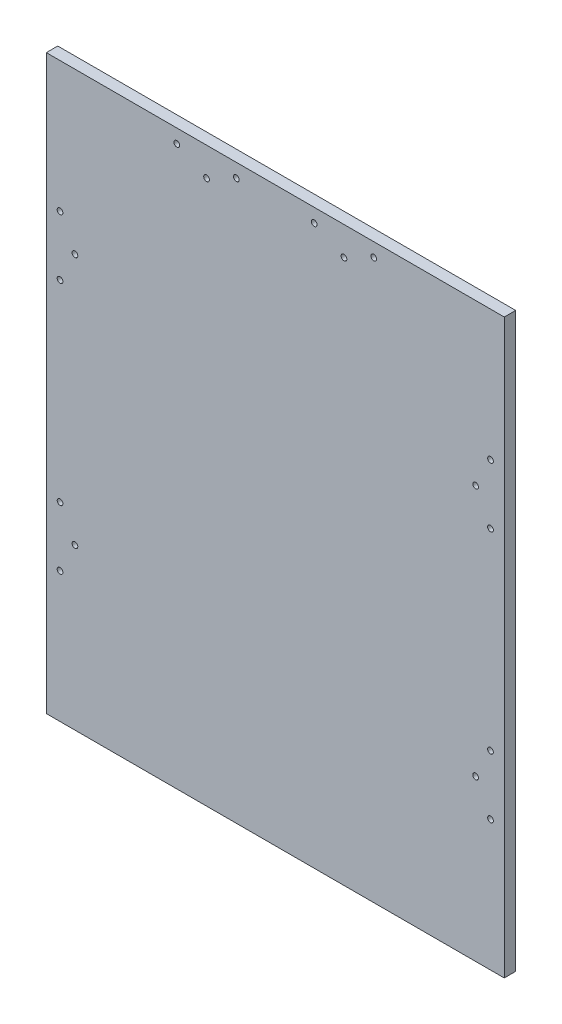
ISO-10303-21;
HEADER;
FILE_DESCRIPTION(('STEP AP214'),'2;1');
FILE_NAME('part.step','',(''),(''),'','','');
FILE_SCHEMA(('AUTOMOTIVE_DESIGN { 1 0 10303 214 1 1 1 1 }'));
ENDSEC;
DATA;
#1=APPLICATION_CONTEXT('core data for automotive mechanical design processes');
#2=APPLICATION_PROTOCOL_DEFINITION('international standard','automotive_design',2000,#1);
#3=PRODUCT_CONTEXT('',#1,'mechanical');
#4=PRODUCT('Part','Part','',(#3));
#5=PRODUCT_RELATED_PRODUCT_CATEGORY('part','',(#4));
#6=PRODUCT_DEFINITION_FORMATION('','',#4);
#7=PRODUCT_DEFINITION_CONTEXT('part definition',#1,'design');
#8=PRODUCT_DEFINITION('design','',#6,#7);
#9=PRODUCT_DEFINITION_SHAPE('','',#8);
#10=(LENGTH_UNIT() NAMED_UNIT(*) SI_UNIT(.MILLI.,.METRE.));
#11=(NAMED_UNIT(*) PLANE_ANGLE_UNIT() SI_UNIT($,.RADIAN.));
#12=(NAMED_UNIT(*) SI_UNIT($,.STERADIAN.) SOLID_ANGLE_UNIT());
#13=UNCERTAINTY_MEASURE_WITH_UNIT(LENGTH_MEASURE(1.E-05),#10,'distance_accuracy_value','');
#14=(GEOMETRIC_REPRESENTATION_CONTEXT(3) GLOBAL_UNCERTAINTY_ASSIGNED_CONTEXT((#13)) GLOBAL_UNIT_ASSIGNED_CONTEXT((#10,
#11,#12)) REPRESENTATION_CONTEXT('',''));
#15=CARTESIAN_POINT('',(0.,0.,0.));
#16=DIRECTION('',(0.,0.,1.));
#17=DIRECTION('',(1.,0.,0.));
#18=AXIS2_PLACEMENT_3D('',#15,#16,#17);
#19=CARTESIAN_POINT('',(-200.,-250.,10.));
#20=DIRECTION('',(1.,0.,0.));
#21=DIRECTION('',(0.,0.,-1.));
#22=AXIS2_PLACEMENT_3D('',#19,#20,#21);
#23=PLANE('',#22);
#24=DIRECTION('',(0.,-1.,0.));
#25=VECTOR('',#24,1.);
#26=CARTESIAN_POINT('',(-200.,-250.,0.));
#27=LINE('',#26,#25);
#28=CARTESIAN_POINT('',(-200.,250.,0.));
#29=VERTEX_POINT('',#28);
#30=CARTESIAN_POINT('',(-200.,-250.,0.));
#31=VERTEX_POINT('',#30);
#32=EDGE_CURVE('E96',#29,#31,#27,.T.);
#33=ORIENTED_EDGE('',*,*,#32,.T.);
#34=DIRECTION('',(0.,0.,-1.));
#35=VECTOR('',#34,1.);
#36=CARTESIAN_POINT('',(-200.,-250.,10.));
#37=LINE('',#36,#35);
#38=CARTESIAN_POINT('',(-200.,-250.,10.));
#39=VERTEX_POINT('',#38);
#40=EDGE_CURVE('E11',#39,#31,#37,.T.);
#41=ORIENTED_EDGE('',*,*,#40,.F.);
#42=DIRECTION('',(0.,-1.,0.));
#43=VECTOR('',#42,1.);
#44=CARTESIAN_POINT('',(-200.,-250.,10.));
#45=LINE('',#44,#43);
#46=CARTESIAN_POINT('',(-200.,250.,10.));
#47=VERTEX_POINT('',#46);
#48=EDGE_CURVE('E84',#47,#39,#45,.T.);
#49=ORIENTED_EDGE('',*,*,#48,.F.);
#50=DIRECTION('',(0.,0.,-1.));
#51=VECTOR('',#50,1.);
#52=CARTESIAN_POINT('',(-200.,250.,10.));
#53=LINE('',#52,#51);
#54=EDGE_CURVE('E92',#47,#29,#53,.T.);
#55=ORIENTED_EDGE('',*,*,#54,.T.);
#56=EDGE_LOOP('',(#33,#41,#49,#55));
#57=FACE_BOUND('',#56,.T.);
#58=ADVANCED_FACE('F33',(#57),#23,.F.);
#59=CARTESIAN_POINT('',(200.,-250.,10.));
#60=DIRECTION('',(0.,1.,0.));
#61=DIRECTION('',(-1.,0.,0.));
#62=AXIS2_PLACEMENT_3D('',#59,#60,#61);
#63=PLANE('',#62);
#64=CARTESIAN_POINT('',(20.25,-250.,5.));
#65=DIRECTION('',(0.,-1.,0.));
#66=DIRECTION('',(1.,0.,0.));
#67=AXIS2_PLACEMENT_3D('',#64,#65,#66);
#68=CIRCLE('',#67,2.49999999999999);
#69=CARTESIAN_POINT('',(22.75,-250.,5.));
#70=VERTEX_POINT('',#69);
#71=EDGE_CURVE('E224',#70,#70,#68,.T.);
#72=ORIENTED_EDGE('',*,*,#71,.F.);
#73=EDGE_LOOP('',(#72));
#74=FACE_BOUND('',#73,.T.);
#75=CARTESIAN_POINT('',(-20.25,-250.,5.));
#76=DIRECTION('',(0.,-1.,0.));
#77=DIRECTION('',(1.,0.,0.));
#78=AXIS2_PLACEMENT_3D('',#75,#76,#77);
#79=CIRCLE('',#78,2.5);
#80=CARTESIAN_POINT('',(-17.75,-250.,5.));
#81=VERTEX_POINT('',#80);
#82=EDGE_CURVE('E218',#81,#81,#79,.T.);
#83=ORIENTED_EDGE('',*,*,#82,.F.);
#84=EDGE_LOOP('',(#83));
#85=FACE_BOUND('',#84,.T.);
#86=DIRECTION('',(1.,0.,0.));
#87=VECTOR('',#86,1.);
#88=CARTESIAN_POINT('',(200.,-250.,0.));
#89=LINE('',#88,#87);
#90=CARTESIAN_POINT('',(200.,-250.,0.));
#91=VERTEX_POINT('',#90);
#92=EDGE_CURVE('E88',#31,#91,#89,.T.);
#93=ORIENTED_EDGE('',*,*,#92,.T.);
#94=DIRECTION('',(0.,0.,-1.));
#95=VECTOR('',#94,1.);
#96=CARTESIAN_POINT('',(200.,-250.,10.));
#97=LINE('',#96,#95);
#98=CARTESIAN_POINT('',(200.,-250.,10.));
#99=VERTEX_POINT('',#98);
#100=EDGE_CURVE('E41',#99,#91,#97,.T.);
#101=ORIENTED_EDGE('',*,*,#100,.F.);
#102=DIRECTION('',(1.,0.,0.));
#103=VECTOR('',#102,1.);
#104=CARTESIAN_POINT('',(200.,-250.,10.));
#105=LINE('',#104,#103);
#106=EDGE_CURVE('E79',#39,#99,#105,.T.);
#107=ORIENTED_EDGE('',*,*,#106,.F.);
#108=ORIENTED_EDGE('',*,*,#40,.T.);
#109=EDGE_LOOP('',(#93,#101,#107,#108));
#110=FACE_BOUND('',#109,.T.);
#111=ADVANCED_FACE('F87',(#74,#85,#110),#63,.F.);
#112=CARTESIAN_POINT('',(200.,-250.,10.));
#113=DIRECTION('',(-1.,0.,0.));
#114=DIRECTION('',(0.,0.,1.));
#115=AXIS2_PLACEMENT_3D('',#112,#113,#114);
#116=PLANE('',#115);
#117=DIRECTION('',(0.,1.,0.));
#118=VECTOR('',#117,1.);
#119=CARTESIAN_POINT('',(200.,-250.,0.));
#120=LINE('',#119,#118);
#121=CARTESIAN_POINT('',(200.,250.,0.));
#122=VERTEX_POINT('',#121);
#123=EDGE_CURVE('E66',#91,#122,#120,.T.);
#124=ORIENTED_EDGE('',*,*,#123,.T.);
#125=DIRECTION('',(0.,0.,-1.));
#126=VECTOR('',#125,1.);
#127=CARTESIAN_POINT('',(200.,250.,10.));
#128=LINE('',#127,#126);
#129=CARTESIAN_POINT('',(200.,250.,10.));
#130=VERTEX_POINT('',#129);
#131=EDGE_CURVE('E89',#130,#122,#128,.T.);
#132=ORIENTED_EDGE('',*,*,#131,.F.);
#133=DIRECTION('',(0.,1.,0.));
#134=VECTOR('',#133,1.);
#135=CARTESIAN_POINT('',(200.,-250.,10.));
#136=LINE('',#135,#134);
#137=EDGE_CURVE('E82',#99,#130,#136,.T.);
#138=ORIENTED_EDGE('',*,*,#137,.F.);
#139=ORIENTED_EDGE('',*,*,#100,.T.);
#140=EDGE_LOOP('',(#124,#132,#138,#139));
#141=FACE_BOUND('',#140,.T.);
#142=ADVANCED_FACE('F90',(#141),#116,.F.);
#143=CARTESIAN_POINT('',(200.,250.,10.));
#144=DIRECTION('',(0.,-1.,0.));
#145=DIRECTION('',(0.,0.,-1.));
#146=AXIS2_PLACEMENT_3D('',#143,#144,#145);
#147=PLANE('',#146);
#148=DIRECTION('',(-1.,0.,0.));
#149=VECTOR('',#148,1.);
#150=CARTESIAN_POINT('',(200.,250.,0.));
#151=LINE('',#150,#149);
#152=EDGE_CURVE('E72',#122,#29,#151,.T.);
#153=ORIENTED_EDGE('',*,*,#152,.T.);
#154=ORIENTED_EDGE('',*,*,#54,.F.);
#155=DIRECTION('',(-1.,0.,0.));
#156=VECTOR('',#155,1.);
#157=CARTESIAN_POINT('',(200.,250.,10.));
#158=LINE('',#157,#156);
#159=EDGE_CURVE('E49',#130,#47,#158,.T.);
#160=ORIENTED_EDGE('',*,*,#159,.F.);
#161=ORIENTED_EDGE('',*,*,#131,.T.);
#162=EDGE_LOOP('',(#153,#154,#160,#161));
#163=FACE_BOUND('',#162,.T.);
#164=ADVANCED_FACE('F104',(#163),#147,.F.);
#165=CARTESIAN_POINT('',(0.,0.,10.));
#166=DIRECTION('',(0.,0.,1.));
#167=DIRECTION('',(1.,0.,0.));
#168=AXIS2_PLACEMENT_3D('',#165,#166,#167);
#169=PLANE('',#168);
#170=CARTESIAN_POINT('',(-34.,238.,10.));
#171=DIRECTION('',(0.,0.,1.));
#172=DIRECTION('',(1.,0.,0.));
#173=AXIS2_PLACEMENT_3D('',#170,#171,#172);
#174=CIRCLE('',#173,2.5);
#175=CARTESIAN_POINT('',(-31.5,238.,10.));
#176=VERTEX_POINT('',#175);
#177=EDGE_CURVE('E141',#176,#176,#174,.T.);
#178=ORIENTED_EDGE('',*,*,#177,.F.);
#179=EDGE_LOOP('',(#178));
#180=FACE_BOUND('',#179,.T.);
#181=CARTESIAN_POINT('',(-60.,225.,10.));
#182=DIRECTION('',(0.,0.,1.));
#183=DIRECTION('',(1.,0.,0.));
#184=AXIS2_PLACEMENT_3D('',#181,#182,#183);
#185=CIRCLE('',#184,2.5);
#186=CARTESIAN_POINT('',(-57.5,225.,10.));
#187=VERTEX_POINT('',#186);
#188=EDGE_CURVE('E201',#187,#187,#185,.T.);
#189=ORIENTED_EDGE('',*,*,#188,.F.);
#190=EDGE_LOOP('',(#189));
#191=FACE_BOUND('',#190,.T.);
#192=CARTESIAN_POINT('',(-86.,238.,10.));
#193=DIRECTION('',(0.,0.,1.));
#194=DIRECTION('',(1.,0.,0.));
#195=AXIS2_PLACEMENT_3D('',#192,#193,#194);
#196=CIRCLE('',#195,2.5);
#197=CARTESIAN_POINT('',(-83.5,238.,10.));
#198=VERTEX_POINT('',#197);
#199=EDGE_CURVE('E207',#198,#198,#196,.T.);
#200=ORIENTED_EDGE('',*,*,#199,.F.);
#201=EDGE_LOOP('',(#200));
#202=FACE_BOUND('',#201,.T.);
#203=CARTESIAN_POINT('',(-188.,83.9999999999999,10.));
#204=DIRECTION('',(0.,0.,1.));
#205=DIRECTION('',(1.,0.,0.));
#206=AXIS2_PLACEMENT_3D('',#203,#204,#205);
#207=CIRCLE('',#206,2.5);
#208=CARTESIAN_POINT('',(-185.5,83.9999999999999,10.));
#209=VERTEX_POINT('',#208);
#210=EDGE_CURVE('E213',#209,#209,#207,.T.);
#211=ORIENTED_EDGE('',*,*,#210,.F.);
#212=EDGE_LOOP('',(#211));
#213=FACE_BOUND('',#212,.T.);
#214=CARTESIAN_POINT('',(-175.,110.,10.));
#215=DIRECTION('',(0.,0.,1.));
#216=DIRECTION('',(1.,0.,0.));
#217=AXIS2_PLACEMENT_3D('',#214,#215,#216);
#218=CIRCLE('',#217,2.5);
#219=CARTESIAN_POINT('',(-172.5,110.,10.));
#220=VERTEX_POINT('',#219);
#221=EDGE_CURVE('E172',#220,#220,#218,.T.);
#222=ORIENTED_EDGE('',*,*,#221,.F.);
#223=EDGE_LOOP('',(#222));
#224=FACE_BOUND('',#223,.T.);
#225=CARTESIAN_POINT('',(-188.,136.,10.));
#226=DIRECTION('',(0.,0.,1.));
#227=DIRECTION('',(1.,0.,0.));
#228=AXIS2_PLACEMENT_3D('',#225,#226,#227);
#229=CIRCLE('',#228,2.5);
#230=CARTESIAN_POINT('',(-185.5,136.,10.));
#231=VERTEX_POINT('',#230);
#232=EDGE_CURVE('E179',#231,#231,#229,.T.);
#233=ORIENTED_EDGE('',*,*,#232,.F.);
#234=EDGE_LOOP('',(#233));
#235=FACE_BOUND('',#234,.T.);
#236=CARTESIAN_POINT('',(-188.,-84.0000000000001,10.));
#237=DIRECTION('',(0.,0.,1.));
#238=DIRECTION('',(1.,0.,0.));
#239=AXIS2_PLACEMENT_3D('',#236,#237,#238);
#240=CIRCLE('',#239,2.5);
#241=CARTESIAN_POINT('',(-185.5,-84.0000000000001,10.));
#242=VERTEX_POINT('',#241);
#243=EDGE_CURVE('E185',#242,#242,#240,.T.);
#244=ORIENTED_EDGE('',*,*,#243,.F.);
#245=EDGE_LOOP('',(#244));
#246=FACE_BOUND('',#245,.T.);
#247=CARTESIAN_POINT('',(-175.,-110.,10.));
#248=DIRECTION('',(0.,0.,1.));
#249=DIRECTION('',(1.,0.,0.));
#250=AXIS2_PLACEMENT_3D('',#247,#248,#249);
#251=CIRCLE('',#250,2.5);
#252=CARTESIAN_POINT('',(-172.5,-110.,10.));
#253=VERTEX_POINT('',#252);
#254=EDGE_CURVE('E191',#253,#253,#251,.T.);
#255=ORIENTED_EDGE('',*,*,#254,.F.);
#256=EDGE_LOOP('',(#255));
#257=FACE_BOUND('',#256,.T.);
#258=CARTESIAN_POINT('',(188.,-136.,10.));
#259=DIRECTION('',(0.,0.,1.));
#260=DIRECTION('',(1.,0.,0.));
#261=AXIS2_PLACEMENT_3D('',#258,#259,#260);
#262=CIRCLE('',#261,2.5);
#263=CARTESIAN_POINT('',(190.5,-136.,10.));
#264=VERTEX_POINT('',#263);
#265=EDGE_CURVE('E142',#264,#264,#262,.T.);
#266=ORIENTED_EDGE('',*,*,#265,.F.);
#267=EDGE_LOOP('',(#266));
#268=FACE_BOUND('',#267,.T.);
#269=CARTESIAN_POINT('',(175.,-110.,10.));
#270=DIRECTION('',(0.,0.,1.));
#271=DIRECTION('',(1.,0.,0.));
#272=AXIS2_PLACEMENT_3D('',#269,#270,#271);
#273=CIRCLE('',#272,2.5);
#274=CARTESIAN_POINT('',(177.5,-110.,10.));
#275=VERTEX_POINT('',#274);
#276=EDGE_CURVE('E149',#275,#275,#273,.T.);
#277=ORIENTED_EDGE('',*,*,#276,.F.);
#278=EDGE_LOOP('',(#277));
#279=FACE_BOUND('',#278,.T.);
#280=CARTESIAN_POINT('',(188.,-84.0000000000001,10.));
#281=DIRECTION('',(0.,0.,1.));
#282=DIRECTION('',(1.,0.,0.));
#283=AXIS2_PLACEMENT_3D('',#280,#281,#282);
#284=CIRCLE('',#283,2.5);
#285=CARTESIAN_POINT('',(190.5,-84.0000000000001,10.));
#286=VERTEX_POINT('',#285);
#287=EDGE_CURVE('E155',#286,#286,#284,.T.);
#288=ORIENTED_EDGE('',*,*,#287,.F.);
#289=EDGE_LOOP('',(#288));
#290=FACE_BOUND('',#289,.T.);
#291=CARTESIAN_POINT('',(188.,84.,10.));
#292=DIRECTION('',(0.,0.,1.));
#293=DIRECTION('',(1.,0.,0.));
#294=AXIS2_PLACEMENT_3D('',#291,#292,#293);
#295=CIRCLE('',#294,2.5);
#296=CARTESIAN_POINT('',(190.5,84.,10.));
#297=VERTEX_POINT('',#296);
#298=EDGE_CURVE('E161',#297,#297,#295,.T.);
#299=ORIENTED_EDGE('',*,*,#298,.F.);
#300=EDGE_LOOP('',(#299));
#301=FACE_BOUND('',#300,.T.);
#302=CARTESIAN_POINT('',(188.,136.,10.));
#303=DIRECTION('',(0.,0.,1.));
#304=DIRECTION('',(1.,0.,0.));
#305=AXIS2_PLACEMENT_3D('',#302,#303,#304);
#306=CIRCLE('',#305,2.5);
#307=CARTESIAN_POINT('',(190.5,136.,10.));
#308=VERTEX_POINT('',#307);
#309=EDGE_CURVE('E167',#308,#308,#306,.T.);
#310=ORIENTED_EDGE('',*,*,#309,.F.);
#311=EDGE_LOOP('',(#310));
#312=FACE_BOUND('',#311,.T.);
#313=CARTESIAN_POINT('',(175.,110.,10.));
#314=DIRECTION('',(0.,0.,1.));
#315=DIRECTION('',(1.,0.,0.));
#316=AXIS2_PLACEMENT_3D('',#313,#314,#315);
#317=CIRCLE('',#316,2.5);
#318=CARTESIAN_POINT('',(177.5,110.,10.));
#319=VERTEX_POINT('',#318);
#320=EDGE_CURVE('E116',#319,#319,#317,.T.);
#321=ORIENTED_EDGE('',*,*,#320,.F.);
#322=EDGE_LOOP('',(#321));
#323=FACE_BOUND('',#322,.T.);
#324=CARTESIAN_POINT('',(86.,238.,10.));
#325=DIRECTION('',(0.,0.,1.));
#326=DIRECTION('',(1.,0.,0.));
#327=AXIS2_PLACEMENT_3D('',#324,#325,#326);
#328=CIRCLE('',#327,2.50000000000001);
#329=CARTESIAN_POINT('',(88.5,238.,10.));
#330=VERTEX_POINT('',#329);
#331=EDGE_CURVE('E123',#330,#330,#328,.T.);
#332=ORIENTED_EDGE('',*,*,#331,.F.);
#333=EDGE_LOOP('',(#332));
#334=FACE_BOUND('',#333,.T.);
#335=CARTESIAN_POINT('',(60.,225.,10.));
#336=DIRECTION('',(0.,0.,1.));
#337=DIRECTION('',(1.,0.,0.));
#338=AXIS2_PLACEMENT_3D('',#335,#336,#337);
#339=CIRCLE('',#338,2.5);
#340=CARTESIAN_POINT('',(62.5,225.,10.));
#341=VERTEX_POINT('',#340);
#342=EDGE_CURVE('E129',#341,#341,#339,.T.);
#343=ORIENTED_EDGE('',*,*,#342,.F.);
#344=EDGE_LOOP('',(#343));
#345=FACE_BOUND('',#344,.T.);
#346=CARTESIAN_POINT('',(34.,238.,10.));
#347=DIRECTION('',(0.,0.,1.));
#348=DIRECTION('',(1.,0.,0.));
#349=AXIS2_PLACEMENT_3D('',#346,#347,#348);
#350=CIRCLE('',#349,2.5);
#351=CARTESIAN_POINT('',(36.5,238.,10.));
#352=VERTEX_POINT('',#351);
#353=EDGE_CURVE('E135',#352,#352,#350,.T.);
#354=ORIENTED_EDGE('',*,*,#353,.F.);
#355=EDGE_LOOP('',(#354));
#356=FACE_BOUND('',#355,.T.);
#357=CARTESIAN_POINT('',(-188.,-136.,10.));
#358=DIRECTION('',(0.,0.,1.));
#359=DIRECTION('',(1.,0.,0.));
#360=AXIS2_PLACEMENT_3D('',#357,#358,#359);
#361=CIRCLE('',#360,2.5);
#362=CARTESIAN_POINT('',(-185.5,-136.,10.));
#363=VERTEX_POINT('',#362);
#364=EDGE_CURVE('E110',#363,#363,#361,.T.);
#365=ORIENTED_EDGE('',*,*,#364,.F.);
#366=EDGE_LOOP('',(#365));
#367=FACE_BOUND('',#366,.T.);
#368=ORIENTED_EDGE('',*,*,#48,.T.);
#369=ORIENTED_EDGE('',*,*,#106,.T.);
#370=ORIENTED_EDGE('',*,*,#137,.T.);
#371=ORIENTED_EDGE('',*,*,#159,.T.);
#372=EDGE_LOOP('',(#368,#369,#370,#371));
#373=FACE_BOUND('',#372,.T.);
#374=ADVANCED_FACE('F80',(#180,#191,#202,#213,#224,#235,#246,#257,#268,#279,#290,#301,#312,#323,
#334,#345,#356,#367,#373),#169,.T.);
#375=CARTESIAN_POINT('',(0.,0.,0.));
#376=DIRECTION('',(0.,0.,1.));
#377=DIRECTION('',(1.,0.,0.));
#378=AXIS2_PLACEMENT_3D('',#375,#376,#377);
#379=PLANE('',#378);
#380=CARTESIAN_POINT('',(-34.,238.,0.));
#381=DIRECTION('',(0.,0.,1.));
#382=DIRECTION('',(1.,0.,0.));
#383=AXIS2_PLACEMENT_3D('',#380,#381,#382);
#384=CIRCLE('',#383,2.5);
#385=CARTESIAN_POINT('',(-31.5,238.,0.));
#386=VERTEX_POINT('',#385);
#387=EDGE_CURVE('E198',#386,#386,#384,.T.);
#388=ORIENTED_EDGE('',*,*,#387,.T.);
#389=EDGE_LOOP('',(#388));
#390=FACE_BOUND('',#389,.T.);
#391=CARTESIAN_POINT('',(-60.,225.,0.));
#392=DIRECTION('',(0.,0.,1.));
#393=DIRECTION('',(1.,0.,0.));
#394=AXIS2_PLACEMENT_3D('',#391,#392,#393);
#395=CIRCLE('',#394,2.5);
#396=CARTESIAN_POINT('',(-57.5,225.,0.));
#397=VERTEX_POINT('',#396);
#398=EDGE_CURVE('E204',#397,#397,#395,.T.);
#399=ORIENTED_EDGE('',*,*,#398,.T.);
#400=EDGE_LOOP('',(#399));
#401=FACE_BOUND('',#400,.T.);
#402=CARTESIAN_POINT('',(-86.,238.,0.));
#403=DIRECTION('',(0.,0.,1.));
#404=DIRECTION('',(1.,0.,0.));
#405=AXIS2_PLACEMENT_3D('',#402,#403,#404);
#406=CIRCLE('',#405,2.5);
#407=CARTESIAN_POINT('',(-83.5,238.,0.));
#408=VERTEX_POINT('',#407);
#409=EDGE_CURVE('E210',#408,#408,#406,.T.);
#410=ORIENTED_EDGE('',*,*,#409,.T.);
#411=EDGE_LOOP('',(#410));
#412=FACE_BOUND('',#411,.T.);
#413=CARTESIAN_POINT('',(-188.,83.9999999999999,0.));
#414=DIRECTION('',(0.,0.,1.));
#415=DIRECTION('',(1.,0.,0.));
#416=AXIS2_PLACEMENT_3D('',#413,#414,#415);
#417=CIRCLE('',#416,2.5);
#418=CARTESIAN_POINT('',(-185.5,83.9999999999999,0.));
#419=VERTEX_POINT('',#418);
#420=EDGE_CURVE('E176',#419,#419,#417,.T.);
#421=ORIENTED_EDGE('',*,*,#420,.T.);
#422=EDGE_LOOP('',(#421));
#423=FACE_BOUND('',#422,.T.);
#424=CARTESIAN_POINT('',(-175.,110.,0.));
#425=DIRECTION('',(0.,0.,1.));
#426=DIRECTION('',(1.,0.,0.));
#427=AXIS2_PLACEMENT_3D('',#424,#425,#426);
#428=CIRCLE('',#427,2.5);
#429=CARTESIAN_POINT('',(-172.5,110.,0.));
#430=VERTEX_POINT('',#429);
#431=EDGE_CURVE('E175',#430,#430,#428,.T.);
#432=ORIENTED_EDGE('',*,*,#431,.T.);
#433=EDGE_LOOP('',(#432));
#434=FACE_BOUND('',#433,.T.);
#435=CARTESIAN_POINT('',(-188.,136.,0.));
#436=DIRECTION('',(0.,0.,1.));
#437=DIRECTION('',(1.,0.,0.));
#438=AXIS2_PLACEMENT_3D('',#435,#436,#437);
#439=CIRCLE('',#438,2.5);
#440=CARTESIAN_POINT('',(-185.5,136.,0.));
#441=VERTEX_POINT('',#440);
#442=EDGE_CURVE('E182',#441,#441,#439,.T.);
#443=ORIENTED_EDGE('',*,*,#442,.T.);
#444=EDGE_LOOP('',(#443));
#445=FACE_BOUND('',#444,.T.);
#446=CARTESIAN_POINT('',(-188.,-84.0000000000001,0.));
#447=DIRECTION('',(0.,0.,1.));
#448=DIRECTION('',(1.,0.,0.));
#449=AXIS2_PLACEMENT_3D('',#446,#447,#448);
#450=CIRCLE('',#449,2.5);
#451=CARTESIAN_POINT('',(-185.5,-84.0000000000001,0.));
#452=VERTEX_POINT('',#451);
#453=EDGE_CURVE('E188',#452,#452,#450,.T.);
#454=ORIENTED_EDGE('',*,*,#453,.T.);
#455=EDGE_LOOP('',(#454));
#456=FACE_BOUND('',#455,.T.);
#457=CARTESIAN_POINT('',(-175.,-110.,0.));
#458=DIRECTION('',(0.,0.,1.));
#459=DIRECTION('',(1.,0.,0.));
#460=AXIS2_PLACEMENT_3D('',#457,#458,#459);
#461=CIRCLE('',#460,2.5);
#462=CARTESIAN_POINT('',(-172.5,-110.,0.));
#463=VERTEX_POINT('',#462);
#464=EDGE_CURVE('E113',#463,#463,#461,.T.);
#465=ORIENTED_EDGE('',*,*,#464,.T.);
#466=EDGE_LOOP('',(#465));
#467=FACE_BOUND('',#466,.T.);
#468=CARTESIAN_POINT('',(188.,-136.,0.));
#469=DIRECTION('',(0.,0.,1.));
#470=DIRECTION('',(1.,0.,0.));
#471=AXIS2_PLACEMENT_3D('',#468,#469,#470);
#472=CIRCLE('',#471,2.5);
#473=CARTESIAN_POINT('',(190.5,-136.,0.));
#474=VERTEX_POINT('',#473);
#475=EDGE_CURVE('E145',#474,#474,#472,.T.);
#476=ORIENTED_EDGE('',*,*,#475,.T.);
#477=EDGE_LOOP('',(#476));
#478=FACE_BOUND('',#477,.T.);
#479=CARTESIAN_POINT('',(175.,-110.,0.));
#480=DIRECTION('',(0.,0.,1.));
#481=DIRECTION('',(1.,0.,0.));
#482=AXIS2_PLACEMENT_3D('',#479,#480,#481);
#483=CIRCLE('',#482,2.5);
#484=CARTESIAN_POINT('',(177.5,-110.,0.));
#485=VERTEX_POINT('',#484);
#486=EDGE_CURVE('E152',#485,#485,#483,.T.);
#487=ORIENTED_EDGE('',*,*,#486,.T.);
#488=EDGE_LOOP('',(#487));
#489=FACE_BOUND('',#488,.T.);
#490=CARTESIAN_POINT('',(188.,-84.0000000000001,0.));
#491=DIRECTION('',(0.,0.,1.));
#492=DIRECTION('',(1.,0.,0.));
#493=AXIS2_PLACEMENT_3D('',#490,#491,#492);
#494=CIRCLE('',#493,2.5);
#495=CARTESIAN_POINT('',(190.5,-84.0000000000001,0.));
#496=VERTEX_POINT('',#495);
#497=EDGE_CURVE('E158',#496,#496,#494,.T.);
#498=ORIENTED_EDGE('',*,*,#497,.T.);
#499=EDGE_LOOP('',(#498));
#500=FACE_BOUND('',#499,.T.);
#501=CARTESIAN_POINT('',(188.,84.,0.));
#502=DIRECTION('',(0.,0.,1.));
#503=DIRECTION('',(1.,0.,0.));
#504=AXIS2_PLACEMENT_3D('',#501,#502,#503);
#505=CIRCLE('',#504,2.5);
#506=CARTESIAN_POINT('',(190.5,84.,0.));
#507=VERTEX_POINT('',#506);
#508=EDGE_CURVE('E164',#507,#507,#505,.T.);
#509=ORIENTED_EDGE('',*,*,#508,.T.);
#510=EDGE_LOOP('',(#509));
#511=FACE_BOUND('',#510,.T.);
#512=CARTESIAN_POINT('',(188.,136.,0.));
#513=DIRECTION('',(0.,0.,1.));
#514=DIRECTION('',(1.,0.,0.));
#515=AXIS2_PLACEMENT_3D('',#512,#513,#514);
#516=CIRCLE('',#515,2.5);
#517=CARTESIAN_POINT('',(190.5,136.,0.));
#518=VERTEX_POINT('',#517);
#519=EDGE_CURVE('E120',#518,#518,#516,.T.);
#520=ORIENTED_EDGE('',*,*,#519,.T.);
#521=EDGE_LOOP('',(#520));
#522=FACE_BOUND('',#521,.T.);
#523=CARTESIAN_POINT('',(175.,110.,0.));
#524=DIRECTION('',(0.,0.,1.));
#525=DIRECTION('',(1.,0.,0.));
#526=AXIS2_PLACEMENT_3D('',#523,#524,#525);
#527=CIRCLE('',#526,2.5);
#528=CARTESIAN_POINT('',(177.5,110.,0.));
#529=VERTEX_POINT('',#528);
#530=EDGE_CURVE('E119',#529,#529,#527,.T.);
#531=ORIENTED_EDGE('',*,*,#530,.T.);
#532=EDGE_LOOP('',(#531));
#533=FACE_BOUND('',#532,.T.);
#534=CARTESIAN_POINT('',(86.,238.,0.));
#535=DIRECTION('',(0.,0.,1.));
#536=DIRECTION('',(1.,0.,0.));
#537=AXIS2_PLACEMENT_3D('',#534,#535,#536);
#538=CIRCLE('',#537,2.50000000000001);
#539=CARTESIAN_POINT('',(88.5,238.,0.));
#540=VERTEX_POINT('',#539);
#541=EDGE_CURVE('E126',#540,#540,#538,.T.);
#542=ORIENTED_EDGE('',*,*,#541,.T.);
#543=EDGE_LOOP('',(#542));
#544=FACE_BOUND('',#543,.T.);
#545=CARTESIAN_POINT('',(60.,225.,0.));
#546=DIRECTION('',(0.,0.,1.));
#547=DIRECTION('',(1.,0.,0.));
#548=AXIS2_PLACEMENT_3D('',#545,#546,#547);
#549=CIRCLE('',#548,2.5);
#550=CARTESIAN_POINT('',(62.5,225.,0.));
#551=VERTEX_POINT('',#550);
#552=EDGE_CURVE('E132',#551,#551,#549,.T.);
#553=ORIENTED_EDGE('',*,*,#552,.T.);
#554=EDGE_LOOP('',(#553));
#555=FACE_BOUND('',#554,.T.);
#556=CARTESIAN_POINT('',(34.,238.,0.));
#557=DIRECTION('',(0.,0.,1.));
#558=DIRECTION('',(1.,0.,0.));
#559=AXIS2_PLACEMENT_3D('',#556,#557,#558);
#560=CIRCLE('',#559,2.5);
#561=CARTESIAN_POINT('',(36.5,238.,0.));
#562=VERTEX_POINT('',#561);
#563=EDGE_CURVE('E138',#562,#562,#560,.T.);
#564=ORIENTED_EDGE('',*,*,#563,.T.);
#565=EDGE_LOOP('',(#564));
#566=FACE_BOUND('',#565,.T.);
#567=CARTESIAN_POINT('',(-188.,-136.,0.));
#568=DIRECTION('',(0.,0.,1.));
#569=DIRECTION('',(1.,0.,0.));
#570=AXIS2_PLACEMENT_3D('',#567,#568,#569);
#571=CIRCLE('',#570,2.5);
#572=CARTESIAN_POINT('',(-185.5,-136.,0.));
#573=VERTEX_POINT('',#572);
#574=EDGE_CURVE('E99',#573,#573,#571,.T.);
#575=ORIENTED_EDGE('',*,*,#574,.T.);
#576=EDGE_LOOP('',(#575));
#577=FACE_BOUND('',#576,.T.);
#578=ORIENTED_EDGE('',*,*,#32,.F.);
#579=ORIENTED_EDGE('',*,*,#152,.F.);
#580=ORIENTED_EDGE('',*,*,#123,.F.);
#581=ORIENTED_EDGE('',*,*,#92,.F.);
#582=EDGE_LOOP('',(#578,#579,#580,#581));
#583=FACE_BOUND('',#582,.T.);
#584=ADVANCED_FACE('F107',(#390,#401,#412,#423,#434,#445,#456,#467,#478,#489,#500,#511,#522,
#533,#544,#555,#566,#577,#583),#379,.F.);
#585=CARTESIAN_POINT('',(-188.,-136.,0.));
#586=DIRECTION('',(0.,0.,1.));
#587=DIRECTION('',(1.,0.,0.));
#588=AXIS2_PLACEMENT_3D('',#585,#586,#587);
#589=CYLINDRICAL_SURFACE('',#588,2.5);
#590=ORIENTED_EDGE('',*,*,#574,.F.);
#591=EDGE_LOOP('',(#590));
#592=FACE_BOUND('',#591,.T.);
#593=ORIENTED_EDGE('',*,*,#364,.T.);
#594=EDGE_LOOP('',(#593));
#595=FACE_BOUND('',#594,.T.);
#596=ADVANCED_FACE('F292',(#592,#595),#589,.F.);
#597=CARTESIAN_POINT('',(34.,238.,0.));
#598=DIRECTION('',(0.,0.,1.));
#599=DIRECTION('',(1.,0.,0.));
#600=AXIS2_PLACEMENT_3D('',#597,#598,#599);
#601=CYLINDRICAL_SURFACE('',#600,2.5);
#602=ORIENTED_EDGE('',*,*,#563,.F.);
#603=EDGE_LOOP('',(#602));
#604=FACE_BOUND('',#603,.T.);
#605=ORIENTED_EDGE('',*,*,#353,.T.);
#606=EDGE_LOOP('',(#605));
#607=FACE_BOUND('',#606,.T.);
#608=ADVANCED_FACE('F300',(#604,#607),#601,.F.);
#609=CARTESIAN_POINT('',(60.,225.,0.));
#610=DIRECTION('',(0.,0.,1.));
#611=DIRECTION('',(1.,0.,0.));
#612=AXIS2_PLACEMENT_3D('',#609,#610,#611);
#613=CYLINDRICAL_SURFACE('',#612,2.5);
#614=ORIENTED_EDGE('',*,*,#552,.F.);
#615=EDGE_LOOP('',(#614));
#616=FACE_BOUND('',#615,.T.);
#617=ORIENTED_EDGE('',*,*,#342,.T.);
#618=EDGE_LOOP('',(#617));
#619=FACE_BOUND('',#618,.T.);
#620=ADVANCED_FACE('F308',(#616,#619),#613,.F.);
#621=CARTESIAN_POINT('',(86.,238.,0.));
#622=DIRECTION('',(0.,0.,1.));
#623=DIRECTION('',(1.,0.,0.));
#624=AXIS2_PLACEMENT_3D('',#621,#622,#623);
#625=CYLINDRICAL_SURFACE('',#624,2.50000000000001);
#626=ORIENTED_EDGE('',*,*,#541,.F.);
#627=EDGE_LOOP('',(#626));
#628=FACE_BOUND('',#627,.T.);
#629=ORIENTED_EDGE('',*,*,#331,.T.);
#630=EDGE_LOOP('',(#629));
#631=FACE_BOUND('',#630,.T.);
#632=ADVANCED_FACE('F316',(#628,#631),#625,.F.);
#633=CARTESIAN_POINT('',(175.,110.,0.));
#634=DIRECTION('',(0.,0.,1.));
#635=DIRECTION('',(1.,0.,0.));
#636=AXIS2_PLACEMENT_3D('',#633,#634,#635);
#637=CYLINDRICAL_SURFACE('',#636,2.5);
#638=ORIENTED_EDGE('',*,*,#530,.F.);
#639=EDGE_LOOP('',(#638));
#640=FACE_BOUND('',#639,.T.);
#641=ORIENTED_EDGE('',*,*,#320,.T.);
#642=EDGE_LOOP('',(#641));
#643=FACE_BOUND('',#642,.T.);
#644=ADVANCED_FACE('F324',(#640,#643),#637,.F.);
#645=CARTESIAN_POINT('',(188.,136.,0.));
#646=DIRECTION('',(0.,0.,1.));
#647=DIRECTION('',(1.,0.,0.));
#648=AXIS2_PLACEMENT_3D('',#645,#646,#647);
#649=CYLINDRICAL_SURFACE('',#648,2.5);
#650=ORIENTED_EDGE('',*,*,#519,.F.);
#651=EDGE_LOOP('',(#650));
#652=FACE_BOUND('',#651,.T.);
#653=ORIENTED_EDGE('',*,*,#309,.T.);
#654=EDGE_LOOP('',(#653));
#655=FACE_BOUND('',#654,.T.);
#656=ADVANCED_FACE('F332',(#652,#655),#649,.F.);
#657=CARTESIAN_POINT('',(188.,84.,0.));
#658=DIRECTION('',(0.,0.,1.));
#659=DIRECTION('',(1.,0.,0.));
#660=AXIS2_PLACEMENT_3D('',#657,#658,#659);
#661=CYLINDRICAL_SURFACE('',#660,2.5);
#662=ORIENTED_EDGE('',*,*,#508,.F.);
#663=EDGE_LOOP('',(#662));
#664=FACE_BOUND('',#663,.T.);
#665=ORIENTED_EDGE('',*,*,#298,.T.);
#666=EDGE_LOOP('',(#665));
#667=FACE_BOUND('',#666,.T.);
#668=ADVANCED_FACE('F340',(#664,#667),#661,.F.);
#669=CARTESIAN_POINT('',(188.,-84.0000000000001,0.));
#670=DIRECTION('',(0.,0.,1.));
#671=DIRECTION('',(1.,0.,0.));
#672=AXIS2_PLACEMENT_3D('',#669,#670,#671);
#673=CYLINDRICAL_SURFACE('',#672,2.5);
#674=ORIENTED_EDGE('',*,*,#497,.F.);
#675=EDGE_LOOP('',(#674));
#676=FACE_BOUND('',#675,.T.);
#677=ORIENTED_EDGE('',*,*,#287,.T.);
#678=EDGE_LOOP('',(#677));
#679=FACE_BOUND('',#678,.T.);
#680=ADVANCED_FACE('F348',(#676,#679),#673,.F.);
#681=CARTESIAN_POINT('',(175.,-110.,0.));
#682=DIRECTION('',(0.,0.,1.));
#683=DIRECTION('',(1.,0.,0.));
#684=AXIS2_PLACEMENT_3D('',#681,#682,#683);
#685=CYLINDRICAL_SURFACE('',#684,2.5);
#686=ORIENTED_EDGE('',*,*,#486,.F.);
#687=EDGE_LOOP('',(#686));
#688=FACE_BOUND('',#687,.T.);
#689=ORIENTED_EDGE('',*,*,#276,.T.);
#690=EDGE_LOOP('',(#689));
#691=FACE_BOUND('',#690,.T.);
#692=ADVANCED_FACE('F356',(#688,#691),#685,.F.);
#693=CARTESIAN_POINT('',(188.,-136.,0.));
#694=DIRECTION('',(0.,0.,1.));
#695=DIRECTION('',(1.,0.,0.));
#696=AXIS2_PLACEMENT_3D('',#693,#694,#695);
#697=CYLINDRICAL_SURFACE('',#696,2.5);
#698=ORIENTED_EDGE('',*,*,#475,.F.);
#699=EDGE_LOOP('',(#698));
#700=FACE_BOUND('',#699,.T.);
#701=ORIENTED_EDGE('',*,*,#265,.T.);
#702=EDGE_LOOP('',(#701));
#703=FACE_BOUND('',#702,.T.);
#704=ADVANCED_FACE('F364',(#700,#703),#697,.F.);
#705=CARTESIAN_POINT('',(-175.,-110.,0.));
#706=DIRECTION('',(0.,0.,1.));
#707=DIRECTION('',(1.,0.,0.));
#708=AXIS2_PLACEMENT_3D('',#705,#706,#707);
#709=CYLINDRICAL_SURFACE('',#708,2.5);
#710=ORIENTED_EDGE('',*,*,#464,.F.);
#711=EDGE_LOOP('',(#710));
#712=FACE_BOUND('',#711,.T.);
#713=ORIENTED_EDGE('',*,*,#254,.T.);
#714=EDGE_LOOP('',(#713));
#715=FACE_BOUND('',#714,.T.);
#716=ADVANCED_FACE('F372',(#712,#715),#709,.F.);
#717=CARTESIAN_POINT('',(-188.,-84.0000000000001,0.));
#718=DIRECTION('',(0.,0.,1.));
#719=DIRECTION('',(1.,0.,0.));
#720=AXIS2_PLACEMENT_3D('',#717,#718,#719);
#721=CYLINDRICAL_SURFACE('',#720,2.5);
#722=ORIENTED_EDGE('',*,*,#453,.F.);
#723=EDGE_LOOP('',(#722));
#724=FACE_BOUND('',#723,.T.);
#725=ORIENTED_EDGE('',*,*,#243,.T.);
#726=EDGE_LOOP('',(#725));
#727=FACE_BOUND('',#726,.T.);
#728=ADVANCED_FACE('F380',(#724,#727),#721,.F.);
#729=CARTESIAN_POINT('',(-188.,136.,0.));
#730=DIRECTION('',(0.,0.,1.));
#731=DIRECTION('',(1.,0.,0.));
#732=AXIS2_PLACEMENT_3D('',#729,#730,#731);
#733=CYLINDRICAL_SURFACE('',#732,2.5);
#734=ORIENTED_EDGE('',*,*,#442,.F.);
#735=EDGE_LOOP('',(#734));
#736=FACE_BOUND('',#735,.T.);
#737=ORIENTED_EDGE('',*,*,#232,.T.);
#738=EDGE_LOOP('',(#737));
#739=FACE_BOUND('',#738,.T.);
#740=ADVANCED_FACE('F388',(#736,#739),#733,.F.);
#741=CARTESIAN_POINT('',(-175.,110.,0.));
#742=DIRECTION('',(0.,0.,1.));
#743=DIRECTION('',(1.,0.,0.));
#744=AXIS2_PLACEMENT_3D('',#741,#742,#743);
#745=CYLINDRICAL_SURFACE('',#744,2.5);
#746=ORIENTED_EDGE('',*,*,#431,.F.);
#747=EDGE_LOOP('',(#746));
#748=FACE_BOUND('',#747,.T.);
#749=ORIENTED_EDGE('',*,*,#221,.T.);
#750=EDGE_LOOP('',(#749));
#751=FACE_BOUND('',#750,.T.);
#752=ADVANCED_FACE('F396',(#748,#751),#745,.F.);
#753=CARTESIAN_POINT('',(-188.,83.9999999999999,0.));
#754=DIRECTION('',(0.,0.,1.));
#755=DIRECTION('',(1.,0.,0.));
#756=AXIS2_PLACEMENT_3D('',#753,#754,#755);
#757=CYLINDRICAL_SURFACE('',#756,2.5);
#758=ORIENTED_EDGE('',*,*,#420,.F.);
#759=EDGE_LOOP('',(#758));
#760=FACE_BOUND('',#759,.T.);
#761=ORIENTED_EDGE('',*,*,#210,.T.);
#762=EDGE_LOOP('',(#761));
#763=FACE_BOUND('',#762,.T.);
#764=ADVANCED_FACE('F404',(#760,#763),#757,.F.);
#765=CARTESIAN_POINT('',(-86.,238.,0.));
#766=DIRECTION('',(0.,0.,1.));
#767=DIRECTION('',(1.,0.,0.));
#768=AXIS2_PLACEMENT_3D('',#765,#766,#767);
#769=CYLINDRICAL_SURFACE('',#768,2.5);
#770=ORIENTED_EDGE('',*,*,#409,.F.);
#771=EDGE_LOOP('',(#770));
#772=FACE_BOUND('',#771,.T.);
#773=ORIENTED_EDGE('',*,*,#199,.T.);
#774=EDGE_LOOP('',(#773));
#775=FACE_BOUND('',#774,.T.);
#776=ADVANCED_FACE('F412',(#772,#775),#769,.F.);
#777=CARTESIAN_POINT('',(-60.,225.,0.));
#778=DIRECTION('',(0.,0.,1.));
#779=DIRECTION('',(1.,0.,0.));
#780=AXIS2_PLACEMENT_3D('',#777,#778,#779);
#781=CYLINDRICAL_SURFACE('',#780,2.5);
#782=ORIENTED_EDGE('',*,*,#398,.F.);
#783=EDGE_LOOP('',(#782));
#784=FACE_BOUND('',#783,.T.);
#785=ORIENTED_EDGE('',*,*,#188,.T.);
#786=EDGE_LOOP('',(#785));
#787=FACE_BOUND('',#786,.T.);
#788=ADVANCED_FACE('F254',(#784,#787),#781,.F.);
#789=CARTESIAN_POINT('',(-34.,238.,0.));
#790=DIRECTION('',(0.,0.,1.));
#791=DIRECTION('',(1.,0.,0.));
#792=AXIS2_PLACEMENT_3D('',#789,#790,#791);
#793=CYLINDRICAL_SURFACE('',#792,2.5);
#794=ORIENTED_EDGE('',*,*,#387,.F.);
#795=EDGE_LOOP('',(#794));
#796=FACE_BOUND('',#795,.T.);
#797=ORIENTED_EDGE('',*,*,#177,.T.);
#798=EDGE_LOOP('',(#797));
#799=FACE_BOUND('',#798,.T.);
#800=ADVANCED_FACE('F245',(#796,#799),#793,.F.);
#801=CARTESIAN_POINT('',(-20.25,-240.,5.));
#802=DIRECTION('',(0.,-1.,0.));
#803=DIRECTION('',(1.,0.,0.));
#804=AXIS2_PLACEMENT_3D('',#801,#802,#803);
#805=CYLINDRICAL_SURFACE('',#804,2.5);
#806=CARTESIAN_POINT('',(-20.25,-240.,5.));
#807=DIRECTION('',(0.,-1.,0.));
#808=DIRECTION('',(1.,0.,0.));
#809=AXIS2_PLACEMENT_3D('',#806,#807,#808);
#810=CIRCLE('',#809,2.5);
#811=CARTESIAN_POINT('',(-17.75,-240.,5.));
#812=VERTEX_POINT('',#811);
#813=EDGE_CURVE('E146',#812,#812,#810,.T.);
#814=ORIENTED_EDGE('',*,*,#813,.F.);
#815=EDGE_LOOP('',(#814));
#816=FACE_BOUND('',#815,.T.);
#817=ORIENTED_EDGE('',*,*,#82,.T.);
#818=EDGE_LOOP('',(#817));
#819=FACE_BOUND('',#818,.T.);
#820=ADVANCED_FACE('F243',(#816,#819),#805,.F.);
#821=CARTESIAN_POINT('',(-20.25,-240.,5.));
#822=DIRECTION('',(0.,-1.,0.));
#823=DIRECTION('',(1.,0.,0.));
#824=AXIS2_PLACEMENT_3D('',#821,#822,#823);
#825=PLANE('',#824);
#826=ORIENTED_EDGE('',*,*,#813,.T.);
#827=EDGE_LOOP('',(#826));
#828=FACE_BOUND('',#827,.T.);
#829=ADVANCED_FACE('F235',(#828),#825,.T.);
#830=CARTESIAN_POINT('',(20.25,-240.,5.));
#831=DIRECTION('',(0.,-1.,0.));
#832=DIRECTION('',(1.,0.,0.));
#833=AXIS2_PLACEMENT_3D('',#830,#831,#832);
#834=CYLINDRICAL_SURFACE('',#833,2.49999999999999);
#835=CARTESIAN_POINT('',(20.25,-240.,5.));
#836=DIRECTION('',(0.,-1.,0.));
#837=DIRECTION('',(1.,0.,0.));
#838=AXIS2_PLACEMENT_3D('',#835,#836,#837);
#839=CIRCLE('',#838,2.49999999999999);
#840=CARTESIAN_POINT('',(22.75,-240.,5.));
#841=VERTEX_POINT('',#840);
#842=EDGE_CURVE('E221',#841,#841,#839,.T.);
#843=ORIENTED_EDGE('',*,*,#842,.F.);
#844=EDGE_LOOP('',(#843));
#845=FACE_BOUND('',#844,.T.);
#846=ORIENTED_EDGE('',*,*,#71,.T.);
#847=EDGE_LOOP('',(#846));
#848=FACE_BOUND('',#847,.T.);
#849=ADVANCED_FACE('F232',(#845,#848),#834,.F.);
#850=CARTESIAN_POINT('',(20.25,-240.,5.));
#851=DIRECTION('',(0.,-1.,0.));
#852=DIRECTION('',(1.,0.,0.));
#853=AXIS2_PLACEMENT_3D('',#850,#851,#852);
#854=PLANE('',#853);
#855=ORIENTED_EDGE('',*,*,#842,.T.);
#856=EDGE_LOOP('',(#855));
#857=FACE_BOUND('',#856,.T.);
#858=ADVANCED_FACE('F230',(#857),#854,.T.);
#859=CLOSED_SHELL('',(#58,#111,#142,#164,#374,#584,#596,#608,#620,#632,#644,#656,#668,#680,#692,
#704,#716,#728,#740,#752,#764,#776,#788,#800,#820,#829,#849,#858));
#860=MANIFOLD_SOLID_BREP('B2',#859);
#861=ADVANCED_BREP_SHAPE_REPRESENTATION('',(#18,#860),#14);
#862=SHAPE_DEFINITION_REPRESENTATION(#9,#861);
ENDSEC;
END-ISO-10303-21;
